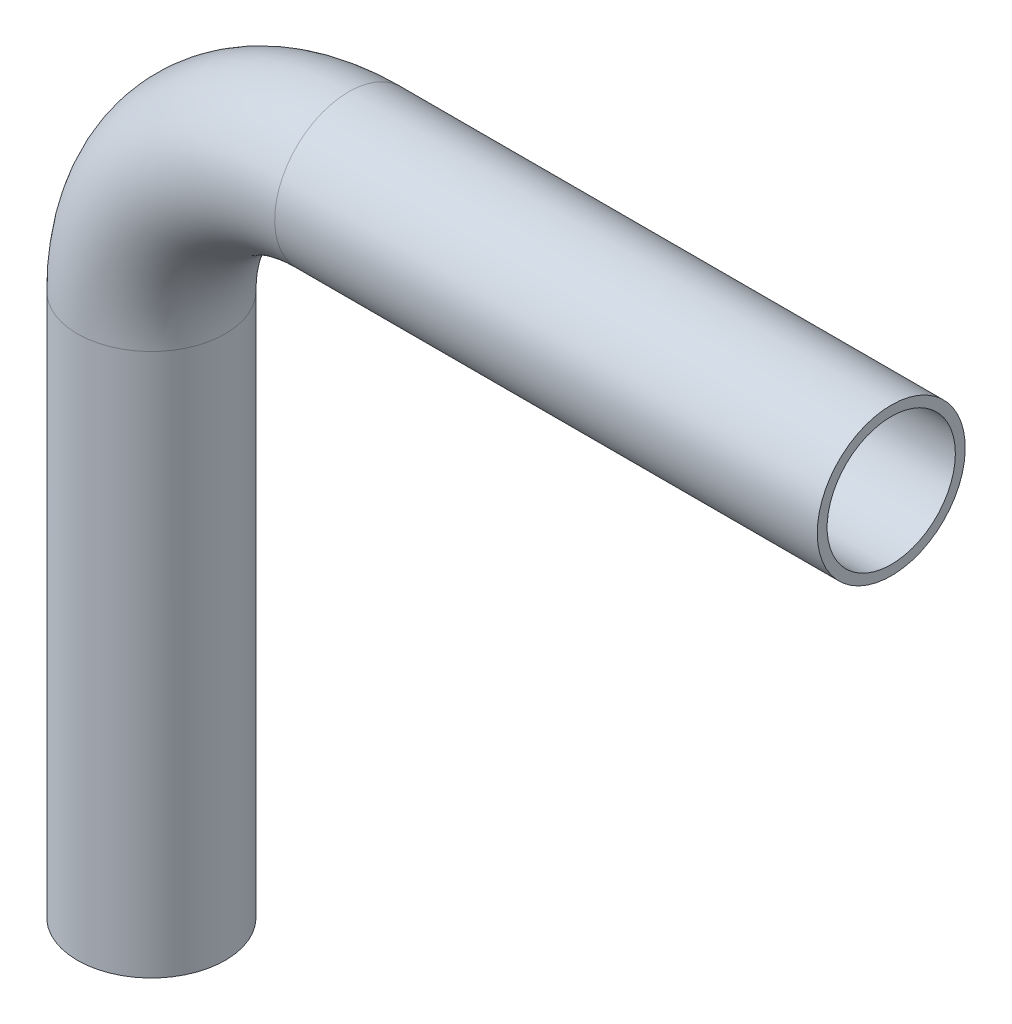
ISO-10303-21;
HEADER;
FILE_DESCRIPTION(('STEP AP214'),'2;1');
FILE_NAME('part.step','',(''),(''),'','','');
FILE_SCHEMA(('AUTOMOTIVE_DESIGN { 1 0 10303 214 1 1 1 1 }'));
ENDSEC;
DATA;
#1=APPLICATION_CONTEXT('core data for automotive mechanical design processes');
#2=APPLICATION_PROTOCOL_DEFINITION('international standard','automotive_design',2000,#1);
#3=PRODUCT_CONTEXT('',#1,'mechanical');
#4=PRODUCT('Part','Part','',(#3));
#5=PRODUCT_RELATED_PRODUCT_CATEGORY('part','',(#4));
#6=PRODUCT_DEFINITION_FORMATION('','',#4);
#7=PRODUCT_DEFINITION_CONTEXT('part definition',#1,'design');
#8=PRODUCT_DEFINITION('design','',#6,#7);
#9=PRODUCT_DEFINITION_SHAPE('','',#8);
#10=(LENGTH_UNIT() NAMED_UNIT(*) SI_UNIT(.MILLI.,.METRE.));
#11=(NAMED_UNIT(*) PLANE_ANGLE_UNIT() SI_UNIT($,.RADIAN.));
#12=(NAMED_UNIT(*) SI_UNIT($,.STERADIAN.) SOLID_ANGLE_UNIT());
#13=UNCERTAINTY_MEASURE_WITH_UNIT(LENGTH_MEASURE(1.E-05),#10,'distance_accuracy_value','');
#14=(GEOMETRIC_REPRESENTATION_CONTEXT(3) GLOBAL_UNCERTAINTY_ASSIGNED_CONTEXT((#13)) GLOBAL_UNIT_ASSIGNED_CONTEXT((#10,
#11,#12)) REPRESENTATION_CONTEXT('',''));
#15=CARTESIAN_POINT('',(0.,0.,0.));
#16=DIRECTION('',(0.,0.,1.));
#17=DIRECTION('',(1.,0.,0.));
#18=AXIS2_PLACEMENT_3D('',#15,#16,#17);
#19=CARTESIAN_POINT('',(0.,0.,0.));
#20=DIRECTION('',(0.,1.,0.));
#21=DIRECTION('',(0.,0.,1.));
#22=AXIS2_PLACEMENT_3D('',#19,#20,#21);
#23=PLANE('',#22);
#24=CARTESIAN_POINT('',(0.,0.,0.));
#25=DIRECTION('',(0.,1.,0.));
#26=DIRECTION('',(0.,0.,1.));
#27=AXIS2_PLACEMENT_3D('',#24,#25,#26);
#28=CIRCLE('',#27,13.);
#29=CARTESIAN_POINT('',(0.,0.,13.));
#30=VERTEX_POINT('',#29);
#31=EDGE_CURVE('E71',#30,#30,#28,.T.);
#32=ORIENTED_EDGE('',*,*,#31,.T.);
#33=EDGE_LOOP('',(#32));
#34=FACE_BOUND('',#33,.T.);
#35=CARTESIAN_POINT('',(0.,0.,0.));
#36=DIRECTION('',(0.,1.,0.));
#37=DIRECTION('',(0.,0.,1.));
#38=AXIS2_PLACEMENT_3D('',#35,#36,#37);
#39=CIRCLE('',#38,15.);
#40=CARTESIAN_POINT('',(0.,0.,15.));
#41=VERTEX_POINT('',#40);
#42=EDGE_CURVE('E60',#41,#41,#39,.T.);
#43=ORIENTED_EDGE('',*,*,#42,.F.);
#44=EDGE_LOOP('',(#43));
#45=FACE_BOUND('',#44,.T.);
#46=ADVANCED_FACE('F43',(#34,#45),#23,.F.);
#47=CARTESIAN_POINT('',(150.,150.,0.));
#48=DIRECTION('',(1.,0.,0.));
#49=DIRECTION('',(0.,0.,1.));
#50=AXIS2_PLACEMENT_3D('',#47,#48,#49);
#51=PLANE('',#50);
#52=CARTESIAN_POINT('',(150.,150.,0.));
#53=DIRECTION('',(1.,0.,0.));
#54=DIRECTION('',(0.,0.,-1.));
#55=AXIS2_PLACEMENT_3D('',#52,#53,#54);
#56=CIRCLE('',#55,13.);
#57=CARTESIAN_POINT('',(150.,150.,-13.));
#58=VERTEX_POINT('',#57);
#59=EDGE_CURVE('E66',#58,#58,#56,.T.);
#60=ORIENTED_EDGE('',*,*,#59,.F.);
#61=EDGE_LOOP('',(#60));
#62=FACE_BOUND('',#61,.T.);
#63=CARTESIAN_POINT('',(150.,150.,0.));
#64=DIRECTION('',(1.,0.,0.));
#65=DIRECTION('',(0.,0.,1.));
#66=AXIS2_PLACEMENT_3D('',#63,#64,#65);
#67=CIRCLE('',#66,15.);
#68=CARTESIAN_POINT('',(150.,150.,15.));
#69=VERTEX_POINT('',#68);
#70=EDGE_CURVE('E10',#69,#69,#67,.T.);
#71=ORIENTED_EDGE('',*,*,#70,.T.);
#72=EDGE_LOOP('',(#71));
#73=FACE_BOUND('',#72,.T.);
#74=ADVANCED_FACE('F111',(#62,#73),#51,.T.);
#75=CARTESIAN_POINT('',(0.,0.,0.));
#76=DIRECTION('',(0.,1.,0.));
#77=DIRECTION('',(0.,0.,1.));
#78=AXIS2_PLACEMENT_3D('',#75,#76,#77);
#79=CYLINDRICAL_SURFACE('',#78,15.);
#80=CARTESIAN_POINT('',(0.,110.,0.));
#81=DIRECTION('',(0.,1.,0.));
#82=DIRECTION('',(0.,0.,1.));
#83=AXIS2_PLACEMENT_3D('',#80,#81,#82);
#84=CIRCLE('',#83,15.);
#85=CARTESIAN_POINT('',(-15.,110.,0.));
#86=VERTEX_POINT('',#85);
#87=EDGE_CURVE('E55',#86,#86,#84,.T.);
#88=ORIENTED_EDGE('',*,*,#87,.F.);
#89=EDGE_LOOP('',(#88));
#90=FACE_BOUND('',#89,.T.);
#91=ORIENTED_EDGE('',*,*,#42,.T.);
#92=EDGE_LOOP('',(#91));
#93=FACE_BOUND('',#92,.T.);
#94=ADVANCED_FACE('F107',(#90,#93),#79,.T.);
#95=CARTESIAN_POINT('',(40.,110.,0.));
#96=DIRECTION('',(0.,0.,-1.));
#97=DIRECTION('',(-1.,0.,0.));
#98=AXIS2_PLACEMENT_3D('',#95,#96,#97);
#99=TOROIDAL_SURFACE('',#98,40.,15.);
#100=CARTESIAN_POINT('',(40.0000000000003,150.,0.));
#101=DIRECTION('',(1.,0.,0.));
#102=DIRECTION('',(0.,0.,1.));
#103=AXIS2_PLACEMENT_3D('',#100,#101,#102);
#104=CIRCLE('',#103,15.);
#105=CARTESIAN_POINT('',(40.0000000000004,165.,0.));
#106=VERTEX_POINT('',#105);
#107=EDGE_CURVE('E50',#106,#106,#104,.T.);
#108=CARTESIAN_POINT('',(40.,110.,0.));
#109=DIRECTION('',(0.,0.,-1.));
#110=DIRECTION('',(-1.,0.,0.));
#111=AXIS2_PLACEMENT_3D('',#108,#109,#110);
#112=CIRCLE('',#111,55.);
#113=EDGE_CURVE('',#86,#106,#112,.T.);
#114=ORIENTED_EDGE('',*,*,#87,.T.);
#115=ORIENTED_EDGE('',*,*,#107,.F.);
#116=ORIENTED_EDGE('',*,*,#113,.T.);
#117=ORIENTED_EDGE('',*,*,#113,.F.);
#118=EDGE_LOOP('',(#114,#116,#115,#117));
#119=FACE_BOUND('',#118,.T.);
#120=ADVANCED_FACE('F100',(#119),#99,.T.);
#121=CARTESIAN_POINT('',(40.0000000000003,150.,0.));
#122=DIRECTION('',(1.,0.,0.));
#123=DIRECTION('',(0.,0.,-1.));
#124=AXIS2_PLACEMENT_3D('',#121,#122,#123);
#125=CYLINDRICAL_SURFACE('',#124,15.);
#126=ORIENTED_EDGE('',*,*,#70,.F.);
#127=EDGE_LOOP('',(#126));
#128=FACE_BOUND('',#127,.T.);
#129=ORIENTED_EDGE('',*,*,#107,.T.);
#130=EDGE_LOOP('',(#129));
#131=FACE_BOUND('',#130,.T.);
#132=ADVANCED_FACE('F97',(#128,#131),#125,.T.);
#133=CARTESIAN_POINT('',(0.,0.,0.));
#134=DIRECTION('',(0.,1.,0.));
#135=DIRECTION('',(0.,0.,1.));
#136=AXIS2_PLACEMENT_3D('',#133,#134,#135);
#137=CYLINDRICAL_SURFACE('',#136,13.);
#138=CARTESIAN_POINT('',(0.,110.,0.));
#139=DIRECTION('',(0.,-1.,0.));
#140=DIRECTION('',(1.,0.,0.));
#141=AXIS2_PLACEMENT_3D('',#138,#139,#140);
#142=CIRCLE('',#141,13.);
#143=CARTESIAN_POINT('',(-13.,110.,0.));
#144=VERTEX_POINT('',#143);
#145=EDGE_CURVE('E75',#144,#144,#142,.F.);
#146=ORIENTED_EDGE('',*,*,#145,.T.);
#147=EDGE_LOOP('',(#146));
#148=FACE_BOUND('',#147,.T.);
#149=ORIENTED_EDGE('',*,*,#31,.F.);
#150=EDGE_LOOP('',(#149));
#151=FACE_BOUND('',#150,.T.);
#152=ADVANCED_FACE('F83',(#148,#151),#137,.F.);
#153=CARTESIAN_POINT('',(40.,110.,0.));
#154=DIRECTION('',(0.,0.,-1.));
#155=DIRECTION('',(-1.,0.,0.));
#156=AXIS2_PLACEMENT_3D('',#153,#154,#155);
#157=TOROIDAL_SURFACE('',#156,40.,13.);
#158=CARTESIAN_POINT('',(40.0000000000003,150.,0.));
#159=DIRECTION('',(1.,0.,0.));
#160=DIRECTION('',(0.,0.,-1.));
#161=AXIS2_PLACEMENT_3D('',#158,#159,#160);
#162=CIRCLE('',#161,13.);
#163=CARTESIAN_POINT('',(40.0000000000004,163.,0.));
#164=VERTEX_POINT('',#163);
#165=EDGE_CURVE('E70',#164,#164,#162,.T.);
#166=CARTESIAN_POINT('',(40.,110.,0.));
#167=DIRECTION('',(0.,0.,-1.));
#168=DIRECTION('',(-1.,0.,0.));
#169=AXIS2_PLACEMENT_3D('',#166,#167,#168);
#170=CIRCLE('',#169,53.);
#171=EDGE_CURVE('',#144,#164,#170,.T.);
#172=ORIENTED_EDGE('',*,*,#145,.F.);
#173=ORIENTED_EDGE('',*,*,#165,.T.);
#174=ORIENTED_EDGE('',*,*,#171,.T.);
#175=ORIENTED_EDGE('',*,*,#171,.F.);
#176=EDGE_LOOP('',(#172,#174,#173,#175));
#177=FACE_BOUND('',#176,.T.);
#178=ADVANCED_FACE('F86',(#177),#157,.F.);
#179=CARTESIAN_POINT('',(40.0000000000003,150.,0.));
#180=DIRECTION('',(1.,0.,0.));
#181=DIRECTION('',(0.,0.,-1.));
#182=AXIS2_PLACEMENT_3D('',#179,#180,#181);
#183=CYLINDRICAL_SURFACE('',#182,13.);
#184=ORIENTED_EDGE('',*,*,#59,.T.);
#185=EDGE_LOOP('',(#184));
#186=FACE_BOUND('',#185,.T.);
#187=ORIENTED_EDGE('',*,*,#165,.F.);
#188=EDGE_LOOP('',(#187));
#189=FACE_BOUND('',#188,.T.);
#190=ADVANCED_FACE('F88',(#186,#189),#183,.F.);
#191=CLOSED_SHELL('',(#46,#74,#94,#120,#132,#152,#178,#190));
#192=MANIFOLD_SOLID_BREP('B2',#191);
#193=ADVANCED_BREP_SHAPE_REPRESENTATION('',(#18,#192),#14);
#194=SHAPE_DEFINITION_REPRESENTATION(#9,#193);
ENDSEC;
END-ISO-10303-21;
